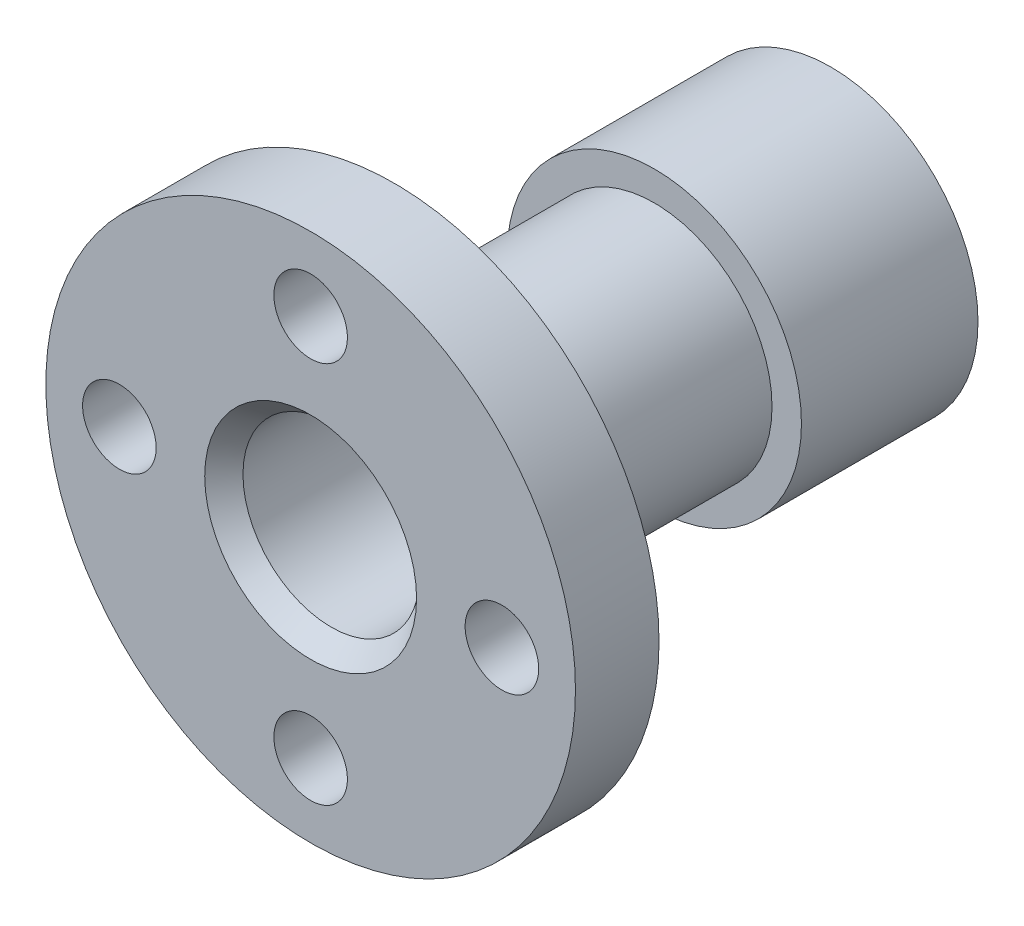
ISO-10303-21;
HEADER;
FILE_DESCRIPTION(('STEP AP214'),'2;1');
FILE_NAME('part.step','',(''),(''),'','','');
FILE_SCHEMA(('AUTOMOTIVE_DESIGN { 1 0 10303 214 1 1 1 1 }'));
ENDSEC;
DATA;
#1=APPLICATION_CONTEXT('core data for automotive mechanical design processes');
#2=APPLICATION_PROTOCOL_DEFINITION('international standard','automotive_design',2000,#1);
#3=PRODUCT_CONTEXT('',#1,'mechanical');
#4=PRODUCT('Part','Part','',(#3));
#5=PRODUCT_RELATED_PRODUCT_CATEGORY('part','',(#4));
#6=PRODUCT_DEFINITION_FORMATION('','',#4);
#7=PRODUCT_DEFINITION_CONTEXT('part definition',#1,'design');
#8=PRODUCT_DEFINITION('design','',#6,#7);
#9=PRODUCT_DEFINITION_SHAPE('','',#8);
#10=(LENGTH_UNIT() NAMED_UNIT(*) SI_UNIT(.MILLI.,.METRE.));
#11=(NAMED_UNIT(*) PLANE_ANGLE_UNIT() SI_UNIT($,.RADIAN.));
#12=(NAMED_UNIT(*) SI_UNIT($,.STERADIAN.) SOLID_ANGLE_UNIT());
#13=UNCERTAINTY_MEASURE_WITH_UNIT(LENGTH_MEASURE(1.E-05),#10,'distance_accuracy_value','');
#14=(GEOMETRIC_REPRESENTATION_CONTEXT(3) GLOBAL_UNCERTAINTY_ASSIGNED_CONTEXT((#13)) GLOBAL_UNIT_ASSIGNED_CONTEXT((#10,
#11,#12)) REPRESENTATION_CONTEXT('',''));
#15=CARTESIAN_POINT('',(0.,0.,0.));
#16=DIRECTION('',(0.,0.,1.));
#17=DIRECTION('',(1.,0.,0.));
#18=AXIS2_PLACEMENT_3D('',#15,#16,#17);
#19=CARTESIAN_POINT('',(0.,0.,14.2));
#20=DIRECTION('',(0.,0.,-1.));
#21=DIRECTION('',(-1.,0.,0.));
#22=AXIS2_PLACEMENT_3D('',#19,#20,#21);
#23=CYLINDRICAL_SURFACE('',#22,45.);
#24=CARTESIAN_POINT('',(0.,0.,14.2));
#25=DIRECTION('',(0.,0.,1.));
#26=DIRECTION('',(1.,0.,0.));
#27=AXIS2_PLACEMENT_3D('',#24,#25,#26);
#28=CIRCLE('',#27,45.);
#29=CARTESIAN_POINT('',(45.,0.,14.2));
#30=VERTEX_POINT('',#29);
#31=EDGE_CURVE('E61',#30,#30,#28,.T.);
#32=ORIENTED_EDGE('',*,*,#31,.F.);
#33=EDGE_LOOP('',(#32));
#34=FACE_BOUND('',#33,.T.);
#35=CARTESIAN_POINT('',(0.,0.,0.));
#36=DIRECTION('',(0.,0.,1.));
#37=DIRECTION('',(1.,0.,0.));
#38=AXIS2_PLACEMENT_3D('',#35,#36,#37);
#39=CIRCLE('',#38,45.);
#40=CARTESIAN_POINT('',(45.,0.,0.));
#41=VERTEX_POINT('',#40);
#42=EDGE_CURVE('E66',#41,#41,#39,.T.);
#43=ORIENTED_EDGE('',*,*,#42,.T.);
#44=EDGE_LOOP('',(#43));
#45=FACE_BOUND('',#44,.T.);
#46=ADVANCED_FACE('F47',(#34,#45),#23,.T.);
#47=CARTESIAN_POINT('',(0.,0.,14.2));
#48=DIRECTION('',(0.,0.,1.));
#49=DIRECTION('',(1.,0.,0.));
#50=AXIS2_PLACEMENT_3D('',#47,#48,#49);
#51=PLANE('',#50);
#52=CARTESIAN_POINT('',(-2.26946287024804E-13,-32.5,14.2));
#53=DIRECTION('',(0.,0.,1.));
#54=DIRECTION('',(1.,0.,0.));
#55=AXIS2_PLACEMENT_3D('',#52,#53,#54);
#56=CIRCLE('',#55,6.25);
#57=CARTESIAN_POINT('',(6.24999999999977,-32.5,14.2));
#58=VERTEX_POINT('',#57);
#59=EDGE_CURVE('E122',#58,#58,#56,.T.);
#60=ORIENTED_EDGE('',*,*,#59,.F.);
#61=EDGE_LOOP('',(#60));
#62=FACE_BOUND('',#61,.T.);
#63=CARTESIAN_POINT('',(-32.5,3.40419430537206E-13,14.2));
#64=DIRECTION('',(0.,0.,1.));
#65=DIRECTION('',(1.,0.,0.));
#66=AXIS2_PLACEMENT_3D('',#63,#64,#65);
#67=CIRCLE('',#66,6.25);
#68=CARTESIAN_POINT('',(-26.25,3.40419430537206E-13,14.2));
#69=VERTEX_POINT('',#68);
#70=EDGE_CURVE('E118',#69,#69,#67,.T.);
#71=ORIENTED_EDGE('',*,*,#70,.F.);
#72=EDGE_LOOP('',(#71));
#73=FACE_BOUND('',#72,.T.);
#74=CARTESIAN_POINT('',(32.5,-1.13473143512402E-13,14.2));
#75=DIRECTION('',(0.,0.,1.));
#76=DIRECTION('',(1.,0.,0.));
#77=AXIS2_PLACEMENT_3D('',#74,#75,#76);
#78=CIRCLE('',#77,6.25);
#79=CARTESIAN_POINT('',(38.75,-1.13473143512402E-13,14.2));
#80=VERTEX_POINT('',#79);
#81=EDGE_CURVE('E110',#80,#80,#78,.T.);
#82=ORIENTED_EDGE('',*,*,#81,.F.);
#83=EDGE_LOOP('',(#82));
#84=FACE_BOUND('',#83,.T.);
#85=CARTESIAN_POINT('',(0.,32.5,14.2));
#86=DIRECTION('',(0.,0.,1.));
#87=DIRECTION('',(1.,0.,0.));
#88=AXIS2_PLACEMENT_3D('',#85,#86,#87);
#89=CIRCLE('',#88,6.25);
#90=CARTESIAN_POINT('',(6.25,32.5,14.2));
#91=VERTEX_POINT('',#90);
#92=EDGE_CURVE('E101',#91,#91,#89,.T.);
#93=ORIENTED_EDGE('',*,*,#92,.F.);
#94=EDGE_LOOP('',(#93));
#95=FACE_BOUND('',#94,.T.);
#96=CARTESIAN_POINT('',(0.,0.,14.2));
#97=DIRECTION('',(0.,0.,1.));
#98=DIRECTION('',(1.,0.,0.));
#99=AXIS2_PLACEMENT_3D('',#96,#97,#98);
#100=CIRCLE('',#99,18.);
#101=CARTESIAN_POINT('',(18.,0.,14.2));
#102=VERTEX_POINT('',#101);
#103=EDGE_CURVE('E56',#102,#102,#100,.F.);
#104=ORIENTED_EDGE('',*,*,#103,.T.);
#105=EDGE_LOOP('',(#104));
#106=FACE_BOUND('',#105,.T.);
#107=ORIENTED_EDGE('',*,*,#31,.T.);
#108=EDGE_LOOP('',(#107));
#109=FACE_BOUND('',#108,.T.);
#110=ADVANCED_FACE('F135',(#62,#73,#84,#95,#106,#109),#51,.T.);
#111=CARTESIAN_POINT('',(0.,0.,0.));
#112=DIRECTION('',(0.,0.,1.));
#113=DIRECTION('',(1.,0.,0.));
#114=AXIS2_PLACEMENT_3D('',#111,#112,#113);
#115=PLANE('',#114);
#116=CARTESIAN_POINT('',(-2.26946287024804E-13,-32.5,0.));
#117=DIRECTION('',(0.,0.,1.));
#118=DIRECTION('',(1.,0.,0.));
#119=AXIS2_PLACEMENT_3D('',#116,#117,#118);
#120=CIRCLE('',#119,6.25);
#121=CARTESIAN_POINT('',(6.24999999999977,-32.5,0.));
#122=VERTEX_POINT('',#121);
#123=EDGE_CURVE('E100',#122,#122,#120,.F.);
#124=ORIENTED_EDGE('',*,*,#123,.F.);
#125=EDGE_LOOP('',(#124));
#126=FACE_BOUND('',#125,.T.);
#127=CARTESIAN_POINT('',(-32.5,3.40419430537206E-13,0.));
#128=DIRECTION('',(0.,0.,1.));
#129=DIRECTION('',(1.,0.,0.));
#130=AXIS2_PLACEMENT_3D('',#127,#128,#129);
#131=CIRCLE('',#130,6.25);
#132=CARTESIAN_POINT('',(-26.25,3.40419430537206E-13,0.));
#133=VERTEX_POINT('',#132);
#134=EDGE_CURVE('E114',#133,#133,#131,.F.);
#135=ORIENTED_EDGE('',*,*,#134,.F.);
#136=EDGE_LOOP('',(#135));
#137=FACE_BOUND('',#136,.T.);
#138=CARTESIAN_POINT('',(32.5,-1.13473143512402E-13,0.));
#139=DIRECTION('',(0.,0.,1.));
#140=DIRECTION('',(1.,0.,0.));
#141=AXIS2_PLACEMENT_3D('',#138,#139,#140);
#142=CIRCLE('',#141,6.25);
#143=CARTESIAN_POINT('',(38.75,-1.13473143512402E-13,0.));
#144=VERTEX_POINT('',#143);
#145=EDGE_CURVE('E105',#144,#144,#142,.F.);
#146=ORIENTED_EDGE('',*,*,#145,.F.);
#147=EDGE_LOOP('',(#146));
#148=FACE_BOUND('',#147,.T.);
#149=CARTESIAN_POINT('',(0.,32.5,0.));
#150=DIRECTION('',(0.,0.,1.));
#151=DIRECTION('',(1.,0.,0.));
#152=AXIS2_PLACEMENT_3D('',#149,#150,#151);
#153=CIRCLE('',#152,6.25);
#154=CARTESIAN_POINT('',(6.25,32.5,0.));
#155=VERTEX_POINT('',#154);
#156=EDGE_CURVE('E106',#155,#155,#153,.F.);
#157=ORIENTED_EDGE('',*,*,#156,.F.);
#158=EDGE_LOOP('',(#157));
#159=FACE_BOUND('',#158,.T.);
#160=CARTESIAN_POINT('',(0.,0.,0.));
#161=DIRECTION('',(0.,0.,1.));
#162=DIRECTION('',(1.,0.,0.));
#163=AXIS2_PLACEMENT_3D('',#160,#161,#162);
#164=CIRCLE('',#163,20.);
#165=CARTESIAN_POINT('',(20.,0.,0.));
#166=VERTEX_POINT('',#165);
#167=EDGE_CURVE('E71',#166,#166,#164,.T.);
#168=ORIENTED_EDGE('',*,*,#167,.T.);
#169=EDGE_LOOP('',(#168));
#170=FACE_BOUND('',#169,.T.);
#171=ORIENTED_EDGE('',*,*,#42,.F.);
#172=EDGE_LOOP('',(#171));
#173=FACE_BOUND('',#172,.T.);
#174=ADVANCED_FACE('F138',(#126,#137,#148,#159,#170,#173),#115,.F.);
#175=CARTESIAN_POINT('',(0.,0.,-44.2));
#176=DIRECTION('',(0.,0.,1.));
#177=DIRECTION('',(1.,0.,0.));
#178=AXIS2_PLACEMENT_3D('',#175,#176,#177);
#179=CYLINDRICAL_SURFACE('',#178,20.);
#180=CARTESIAN_POINT('',(0.,0.,-44.2));
#181=DIRECTION('',(0.,0.,1.));
#182=DIRECTION('',(1.,0.,0.));
#183=AXIS2_PLACEMENT_3D('',#180,#181,#182);
#184=CIRCLE('',#183,20.);
#185=CARTESIAN_POINT('',(20.,0.,-44.2));
#186=VERTEX_POINT('',#185);
#187=EDGE_CURVE('E76',#186,#186,#184,.T.);
#188=ORIENTED_EDGE('',*,*,#187,.T.);
#189=EDGE_LOOP('',(#188));
#190=FACE_BOUND('',#189,.T.);
#191=ORIENTED_EDGE('',*,*,#167,.F.);
#192=EDGE_LOOP('',(#191));
#193=FACE_BOUND('',#192,.T.);
#194=ADVANCED_FACE('F153',(#190,#193),#179,.T.);
#195=CARTESIAN_POINT('',(0.,0.,56.6264068711928));
#196=DIRECTION('',(0.,0.,-1.));
#197=DIRECTION('',(-1.,0.,0.));
#198=AXIS2_PLACEMENT_3D('',#195,#196,#197);
#199=CYLINDRICAL_SURFACE('',#198,15.);
#200=CARTESIAN_POINT('',(0.,0.,10.7));
#201=DIRECTION('',(0.,0.,1.));
#202=DIRECTION('',(1.,0.,0.));
#203=AXIS2_PLACEMENT_3D('',#200,#201,#202);
#204=CIRCLE('',#203,15.);
#205=CARTESIAN_POINT('',(15.,0.,10.7));
#206=VERTEX_POINT('',#205);
#207=EDGE_CURVE('E10',#206,#206,#204,.T.);
#208=ORIENTED_EDGE('',*,*,#207,.T.);
#209=EDGE_LOOP('',(#208));
#210=FACE_BOUND('',#209,.T.);
#211=CARTESIAN_POINT('',(0.,0.,-50.2));
#212=DIRECTION('',(0.,0.,-1.));
#213=DIRECTION('',(-1.,0.,0.));
#214=AXIS2_PLACEMENT_3D('',#211,#212,#213);
#215=CIRCLE('',#214,15.);
#216=CARTESIAN_POINT('',(-15.,0.,-50.2));
#217=VERTEX_POINT('',#216);
#218=EDGE_CURVE('E93',#217,#217,#215,.T.);
#219=ORIENTED_EDGE('',*,*,#218,.T.);
#220=EDGE_LOOP('',(#219));
#221=FACE_BOUND('',#220,.T.);
#222=ADVANCED_FACE('F160',(#210,#221),#199,.F.);
#223=CARTESIAN_POINT('',(0.,0.,-44.2));
#224=DIRECTION('',(0.,0.,-1.));
#225=DIRECTION('',(-1.,0.,0.));
#226=AXIS2_PLACEMENT_3D('',#223,#224,#225);
#227=PLANE('',#226);
#228=ORIENTED_EDGE('',*,*,#187,.F.);
#229=EDGE_LOOP('',(#228));
#230=FACE_BOUND('',#229,.T.);
#231=CARTESIAN_POINT('',(0.,0.,-44.2));
#232=DIRECTION('',(0.,0.,-1.));
#233=DIRECTION('',(-1.,0.,0.));
#234=AXIS2_PLACEMENT_3D('',#231,#232,#233);
#235=CIRCLE('',#234,25.);
#236=CARTESIAN_POINT('',(-25.,0.,-44.2));
#237=VERTEX_POINT('',#236);
#238=EDGE_CURVE('E81',#237,#237,#235,.T.);
#239=ORIENTED_EDGE('',*,*,#238,.F.);
#240=EDGE_LOOP('',(#239));
#241=FACE_BOUND('',#240,.T.);
#242=ADVANCED_FACE('F168',(#230,#241),#227,.F.);
#243=CARTESIAN_POINT('',(0.,0.,-74.2));
#244=DIRECTION('',(0.,0.,-1.));
#245=DIRECTION('',(-1.,0.,0.));
#246=AXIS2_PLACEMENT_3D('',#243,#244,#245);
#247=PLANE('',#246);
#248=CARTESIAN_POINT('',(0.,0.,-74.2));
#249=DIRECTION('',(0.,0.,-1.));
#250=DIRECTION('',(-1.,0.,0.));
#251=AXIS2_PLACEMENT_3D('',#248,#249,#250);
#252=CIRCLE('',#251,19.);
#253=CARTESIAN_POINT('',(-19.,0.,-74.2));
#254=VERTEX_POINT('',#253);
#255=EDGE_CURVE('E89',#254,#254,#252,.T.);
#256=ORIENTED_EDGE('',*,*,#255,.F.);
#257=EDGE_LOOP('',(#256));
#258=FACE_BOUND('',#257,.T.);
#259=CARTESIAN_POINT('',(0.,0.,-74.2));
#260=DIRECTION('',(0.,0.,-1.));
#261=DIRECTION('',(-1.,0.,0.));
#262=AXIS2_PLACEMENT_3D('',#259,#260,#261);
#263=CIRCLE('',#262,25.);
#264=CARTESIAN_POINT('',(-25.,0.,-74.2));
#265=VERTEX_POINT('',#264);
#266=EDGE_CURVE('E80',#265,#265,#263,.T.);
#267=ORIENTED_EDGE('',*,*,#266,.T.);
#268=EDGE_LOOP('',(#267));
#269=FACE_BOUND('',#268,.T.);
#270=ADVANCED_FACE('F173',(#258,#269),#247,.T.);
#271=CARTESIAN_POINT('',(0.,0.,-74.2));
#272=DIRECTION('',(0.,0.,1.));
#273=DIRECTION('',(1.,0.,0.));
#274=AXIS2_PLACEMENT_3D('',#271,#272,#273);
#275=CYLINDRICAL_SURFACE('',#274,25.);
#276=ORIENTED_EDGE('',*,*,#266,.F.);
#277=EDGE_LOOP('',(#276));
#278=FACE_BOUND('',#277,.T.);
#279=ORIENTED_EDGE('',*,*,#238,.T.);
#280=EDGE_LOOP('',(#279));
#281=FACE_BOUND('',#280,.T.);
#282=ADVANCED_FACE('F169',(#278,#281),#275,.T.);
#283=CARTESIAN_POINT('',(0.,0.,-50.2));
#284=DIRECTION('',(0.,0.,-1.));
#285=DIRECTION('',(-1.,0.,0.));
#286=AXIS2_PLACEMENT_3D('',#283,#284,#285);
#287=CYLINDRICAL_SURFACE('',#286,19.);
#288=CARTESIAN_POINT('',(0.,0.,-50.2));
#289=DIRECTION('',(0.,0.,-1.));
#290=DIRECTION('',(-1.,0.,0.));
#291=AXIS2_PLACEMENT_3D('',#288,#289,#290);
#292=CIRCLE('',#291,19.);
#293=CARTESIAN_POINT('',(-19.,0.,-50.2));
#294=VERTEX_POINT('',#293);
#295=EDGE_CURVE('E85',#294,#294,#292,.T.);
#296=ORIENTED_EDGE('',*,*,#295,.F.);
#297=EDGE_LOOP('',(#296));
#298=FACE_BOUND('',#297,.T.);
#299=ORIENTED_EDGE('',*,*,#255,.T.);
#300=EDGE_LOOP('',(#299));
#301=FACE_BOUND('',#300,.T.);
#302=ADVANCED_FACE('F172',(#298,#301),#287,.F.);
#303=CARTESIAN_POINT('',(0.,0.,-50.2));
#304=DIRECTION('',(0.,0.,-1.));
#305=DIRECTION('',(-1.,0.,0.));
#306=AXIS2_PLACEMENT_3D('',#303,#304,#305);
#307=PLANE('',#306);
#308=ORIENTED_EDGE('',*,*,#218,.F.);
#309=EDGE_LOOP('',(#308));
#310=FACE_BOUND('',#309,.T.);
#311=ORIENTED_EDGE('',*,*,#295,.T.);
#312=EDGE_LOOP('',(#311));
#313=FACE_BOUND('',#312,.T.);
#314=ADVANCED_FACE('F183',(#310,#313),#307,.T.);
#315=CARTESIAN_POINT('',(0.,0.,14.2));
#316=DIRECTION('',(0.,0.,1.));
#317=DIRECTION('',(1.,0.,0.));
#318=AXIS2_PLACEMENT_3D('',#315,#316,#317);
#319=CONICAL_SURFACE('',#318,18.,0.708626272127672);
#320=CARTESIAN_POINT('',(15.,0.,10.7));
#321=CARTESIAN_POINT('',(15.03125,0.,10.7364583333333));
#322=CARTESIAN_POINT('',(15.0625,0.,10.7729166666666));
#323=CARTESIAN_POINT('',(15.125,0.,10.8458333333333));
#324=CARTESIAN_POINT('',(15.15625,0.,10.8822916666666));
#325=CARTESIAN_POINT('',(15.21875,0.,10.9552083333333));
#326=CARTESIAN_POINT('',(15.25,0.,10.9916666666666));
#327=CARTESIAN_POINT('',(15.3125,0.,11.0645833333333));
#328=CARTESIAN_POINT('',(15.34375,0.,11.1010416666666));
#329=CARTESIAN_POINT('',(15.40625,0.,11.1739583333333));
#330=CARTESIAN_POINT('',(15.4375,0.,11.2104166666666));
#331=CARTESIAN_POINT('',(15.5,0.,11.2833333333333));
#332=CARTESIAN_POINT('',(15.53125,0.,11.3197916666666));
#333=CARTESIAN_POINT('',(15.59375,0.,11.3927083333333));
#334=CARTESIAN_POINT('',(15.625,0.,11.4291666666666));
#335=CARTESIAN_POINT('',(15.6875,0.,11.5020833333333));
#336=CARTESIAN_POINT('',(15.71875,0.,11.5385416666666));
#337=CARTESIAN_POINT('',(15.78125,0.,11.6114583333333));
#338=CARTESIAN_POINT('',(15.8125,0.,11.6479166666666));
#339=CARTESIAN_POINT('',(15.875,0.,11.7208333333333));
#340=CARTESIAN_POINT('',(15.90625,0.,11.7572916666666));
#341=CARTESIAN_POINT('',(15.96875,0.,11.8302083333333));
#342=CARTESIAN_POINT('',(16.,0.,11.8666666666666));
#343=CARTESIAN_POINT('',(16.0625,0.,11.9395833333333));
#344=CARTESIAN_POINT('',(16.09375,0.,11.9760416666666));
#345=CARTESIAN_POINT('',(16.15625,0.,12.0489583333333));
#346=CARTESIAN_POINT('',(16.1875,0.,12.0854166666666));
#347=CARTESIAN_POINT('',(16.25,0.,12.1583333333333));
#348=CARTESIAN_POINT('',(16.28125,0.,12.1947916666667));
#349=CARTESIAN_POINT('',(16.34375,0.,12.2677083333333));
#350=CARTESIAN_POINT('',(16.375,0.,12.3041666666666));
#351=CARTESIAN_POINT('',(16.4375,0.,12.3770833333333));
#352=CARTESIAN_POINT('',(16.46875,0.,12.4135416666667));
#353=CARTESIAN_POINT('',(16.53125,0.,12.4864583333333));
#354=CARTESIAN_POINT('',(16.5625,0.,12.5229166666667));
#355=CARTESIAN_POINT('',(16.625,0.,12.5958333333333));
#356=CARTESIAN_POINT('',(16.65625,0.,12.6322916666667));
#357=CARTESIAN_POINT('',(16.71875,0.,12.7052083333333));
#358=CARTESIAN_POINT('',(16.75,0.,12.7416666666667));
#359=CARTESIAN_POINT('',(16.8125,0.,12.8145833333333));
#360=CARTESIAN_POINT('',(16.84375,0.,12.8510416666667));
#361=CARTESIAN_POINT('',(16.90625,0.,12.9239583333333));
#362=CARTESIAN_POINT('',(16.9375,0.,12.9604166666667));
#363=CARTESIAN_POINT('',(17.,0.,13.0333333333333));
#364=CARTESIAN_POINT('',(17.03125,0.,13.0697916666667));
#365=CARTESIAN_POINT('',(17.09375,0.,13.1427083333333));
#366=CARTESIAN_POINT('',(17.125,0.,13.1791666666667));
#367=CARTESIAN_POINT('',(17.1875,0.,13.2520833333333));
#368=CARTESIAN_POINT('',(17.21875,0.,13.2885416666667));
#369=CARTESIAN_POINT('',(17.28125,0.,13.3614583333333));
#370=CARTESIAN_POINT('',(17.3125,0.,13.3979166666667));
#371=CARTESIAN_POINT('',(17.375,0.,13.4708333333333));
#372=CARTESIAN_POINT('',(17.40625,0.,13.5072916666667));
#373=CARTESIAN_POINT('',(17.46875,0.,13.5802083333333));
#374=CARTESIAN_POINT('',(17.5,0.,13.6166666666667));
#375=CARTESIAN_POINT('',(17.5625,0.,13.6895833333333));
#376=CARTESIAN_POINT('',(17.59375,0.,13.7260416666667));
#377=CARTESIAN_POINT('',(17.65625,0.,13.7989583333333));
#378=CARTESIAN_POINT('',(17.6875,0.,13.8354166666667));
#379=CARTESIAN_POINT('',(17.75,0.,13.9083333333333));
#380=CARTESIAN_POINT('',(17.78125,0.,13.9447916666667));
#381=CARTESIAN_POINT('',(17.84375,0.,14.0177083333333));
#382=CARTESIAN_POINT('',(17.875,0.,14.0541666666667));
#383=CARTESIAN_POINT('',(17.9375,0.,14.1270833333333));
#384=CARTESIAN_POINT('',(17.96875,0.,14.1635416666667));
#385=CARTESIAN_POINT('',(18.,0.,14.2));
#386=B_SPLINE_CURVE_WITH_KNOTS('',3,(#320,#321,#322,#323,#324,#325,#326,#327,#328,#329,#330,
#331,#332,#333,#334,#335,#336,#337,#338,#339,#340,#341,#342,#343,#344,#345,#346,#347,#348,#349,
#350,#351,#352,#353,#354,#355,#356,#357,#358,#359,#360,#361,#362,#363,#364,#365,#366,#367,#368,
#369,#370,#371,#372,#373,#374,#375,#376,#377,#378,#379,#380,#381,#382,#383,#384,#385),
.UNSPECIFIED.,.F.,.F.,(4,2,2,2,2,2,2,2,2,2,2,2,2,2,2,2,2,2,2,2,2,2,2,2,2,2,2,2,2,2,2,2,4),(0.,
0.144055382145204,0.288110764290405,0.432166146435609,0.576221528580811,0.720276910726013,
0.864332292871216,1.00838767501642,1.15244305716162,1.29649843930682,1.44055382145203,
1.58460920359723,1.72866458574243,1.87271996788764,2.01677535003284,2.16083073217804,
2.30488611432324,2.44894149646844,2.59299687861365,2.73705226075885,2.88110764290405,
3.02516302504926,3.16921840719446,3.31327378933966,3.45732917148486,3.60138455363007,
3.74543993577527,3.88949531792047,4.03355070006567,4.17760608221088,4.32166146435608,
4.46571684650128,4.60977222864648),.UNSPECIFIED.);
#387=EDGE_CURVE('BSEAM50',#206,#102,#386,.T.);
#388=ORIENTED_EDGE('',*,*,#207,.F.);
#389=ORIENTED_EDGE('',*,*,#103,.F.);
#390=ORIENTED_EDGE('',*,*,#387,.T.);
#391=ORIENTED_EDGE('',*,*,#387,.F.);
#392=EDGE_LOOP('',(#388,#390,#389,#391));
#393=FACE_BOUND('',#392,.T.);
#394=ADVANCED_FACE('F50',(#393),#319,.F.);
#395=CARTESIAN_POINT('',(0.,32.5,-17.6776695296637));
#396=DIRECTION('',(0.,0.,1.));
#397=DIRECTION('',(1.,0.,0.));
#398=AXIS2_PLACEMENT_3D('',#395,#396,#397);
#399=CYLINDRICAL_SURFACE('',#398,6.25);
#400=ORIENTED_EDGE('',*,*,#156,.T.);
#401=EDGE_LOOP('',(#400));
#402=FACE_BOUND('',#401,.T.);
#403=ORIENTED_EDGE('',*,*,#92,.T.);
#404=EDGE_LOOP('',(#403));
#405=FACE_BOUND('',#404,.T.);
#406=ADVANCED_FACE('F188',(#402,#405),#399,.F.);
#407=CARTESIAN_POINT('',(32.5,-1.13473143512402E-13,-17.6776695296637));
#408=DIRECTION('',(0.,0.,1.));
#409=DIRECTION('',(1.,0.,0.));
#410=AXIS2_PLACEMENT_3D('',#407,#408,#409);
#411=CYLINDRICAL_SURFACE('',#410,6.25);
#412=ORIENTED_EDGE('',*,*,#145,.T.);
#413=EDGE_LOOP('',(#412));
#414=FACE_BOUND('',#413,.T.);
#415=ORIENTED_EDGE('',*,*,#81,.T.);
#416=EDGE_LOOP('',(#415));
#417=FACE_BOUND('',#416,.T.);
#418=ADVANCED_FACE('F190',(#414,#417),#411,.F.);
#419=CARTESIAN_POINT('',(-32.5,3.40419430537206E-13,-17.6776695296637));
#420=DIRECTION('',(0.,0.,1.));
#421=DIRECTION('',(1.,0.,0.));
#422=AXIS2_PLACEMENT_3D('',#419,#420,#421);
#423=CYLINDRICAL_SURFACE('',#422,6.25);
#424=ORIENTED_EDGE('',*,*,#134,.T.);
#425=EDGE_LOOP('',(#424));
#426=FACE_BOUND('',#425,.T.);
#427=ORIENTED_EDGE('',*,*,#70,.T.);
#428=EDGE_LOOP('',(#427));
#429=FACE_BOUND('',#428,.T.);
#430=ADVANCED_FACE('F194',(#426,#429),#423,.F.);
#431=CARTESIAN_POINT('',(-2.26946287024804E-13,-32.5,-17.6776695296637));
#432=DIRECTION('',(0.,0.,1.));
#433=DIRECTION('',(1.,0.,0.));
#434=AXIS2_PLACEMENT_3D('',#431,#432,#433);
#435=CYLINDRICAL_SURFACE('',#434,6.25);
#436=ORIENTED_EDGE('',*,*,#123,.T.);
#437=EDGE_LOOP('',(#436));
#438=FACE_BOUND('',#437,.T.);
#439=ORIENTED_EDGE('',*,*,#59,.T.);
#440=EDGE_LOOP('',(#439));
#441=FACE_BOUND('',#440,.T.);
#442=ADVANCED_FACE('F133',(#438,#441),#435,.F.);
#443=CLOSED_SHELL('',(#46,#110,#174,#194,#222,#242,#270,#282,#302,#314,#394,#406,#418,#430,#442));
#444=MANIFOLD_SOLID_BREP('B2',#443);
#445=ADVANCED_BREP_SHAPE_REPRESENTATION('',(#18,#444),#14);
#446=SHAPE_DEFINITION_REPRESENTATION(#9,#445);
ENDSEC;
END-ISO-10303-21;
